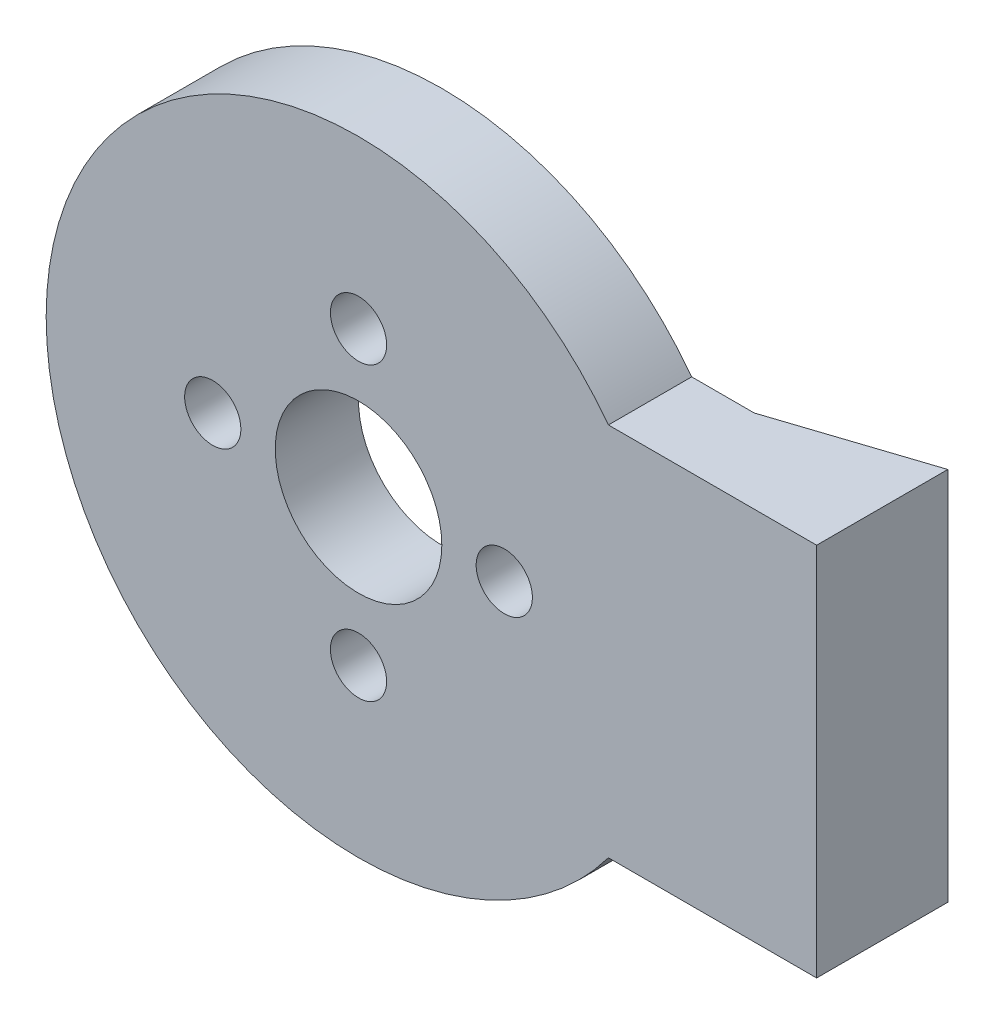
ISO-10303-21;
HEADER;
FILE_DESCRIPTION(('STEP AP214'),'2;1');
FILE_NAME('part.step','',(''),(''),'','','');
FILE_SCHEMA(('AUTOMOTIVE_DESIGN { 1 0 10303 214 1 1 1 1 }'));
ENDSEC;
DATA;
#1=APPLICATION_CONTEXT('core data for automotive mechanical design processes');
#2=APPLICATION_PROTOCOL_DEFINITION('international standard','automotive_design',2000,#1);
#3=PRODUCT_CONTEXT('',#1,'mechanical');
#4=PRODUCT('Part','Part','',(#3));
#5=PRODUCT_RELATED_PRODUCT_CATEGORY('part','',(#4));
#6=PRODUCT_DEFINITION_FORMATION('','',#4);
#7=PRODUCT_DEFINITION_CONTEXT('part definition',#1,'design');
#8=PRODUCT_DEFINITION('design','',#6,#7);
#9=PRODUCT_DEFINITION_SHAPE('','',#8);
#10=(LENGTH_UNIT() NAMED_UNIT(*) SI_UNIT(.MILLI.,.METRE.));
#11=(NAMED_UNIT(*) PLANE_ANGLE_UNIT() SI_UNIT($,.RADIAN.));
#12=(NAMED_UNIT(*) SI_UNIT($,.STERADIAN.) SOLID_ANGLE_UNIT());
#13=UNCERTAINTY_MEASURE_WITH_UNIT(LENGTH_MEASURE(1.E-05),#10,'distance_accuracy_value','');
#14=(GEOMETRIC_REPRESENTATION_CONTEXT(3) GLOBAL_UNCERTAINTY_ASSIGNED_CONTEXT((#13)) GLOBAL_UNIT_ASSIGNED_CONTEXT((#10,
#11,#12)) REPRESENTATION_CONTEXT('',''));
#15=CARTESIAN_POINT('',(0.,0.,0.));
#16=DIRECTION('',(0.,0.,1.));
#17=DIRECTION('',(1.,0.,0.));
#18=AXIS2_PLACEMENT_3D('',#15,#16,#17);
#19=CARTESIAN_POINT('',(22.,-9.,41.8));
#20=DIRECTION('',(0.,0.,1.));
#21=DIRECTION('',(1.,0.,0.));
#22=AXIS2_PLACEMENT_3D('',#19,#20,#21);
#23=PLANE('',#22);
#24=CARTESIAN_POINT('',(-7.,0.,41.8));
#25=DIRECTION('',(0.,0.,-1.));
#26=DIRECTION('',(1.,0.,0.));
#27=AXIS2_PLACEMENT_3D('',#24,#25,#26);
#28=CIRCLE('',#27,1.35);
#29=CARTESIAN_POINT('',(-5.65,0.,41.8));
#30=VERTEX_POINT('',#29);
#31=EDGE_CURVE('E128',#30,#30,#28,.T.);
#32=ORIENTED_EDGE('',*,*,#31,.T.);
#33=EDGE_LOOP('',(#32));
#34=FACE_BOUND('',#33,.T.);
#35=CARTESIAN_POINT('',(0.,-7.,41.8));
#36=DIRECTION('',(0.,0.,-1.));
#37=DIRECTION('',(1.,0.,0.));
#38=AXIS2_PLACEMENT_3D('',#35,#36,#37);
#39=CIRCLE('',#38,1.35);
#40=CARTESIAN_POINT('',(1.35,-7.,41.8));
#41=VERTEX_POINT('',#40);
#42=EDGE_CURVE('E140',#41,#41,#39,.T.);
#43=ORIENTED_EDGE('',*,*,#42,.T.);
#44=EDGE_LOOP('',(#43));
#45=FACE_BOUND('',#44,.T.);
#46=CARTESIAN_POINT('',(0.,0.,41.8));
#47=DIRECTION('',(0.,0.,-1.));
#48=DIRECTION('',(1.,0.,0.));
#49=AXIS2_PLACEMENT_3D('',#46,#47,#48);
#50=CIRCLE('',#49,4.);
#51=CARTESIAN_POINT('',(4.,0.,41.8));
#52=VERTEX_POINT('',#51);
#53=EDGE_CURVE('E41',#52,#52,#50,.T.);
#54=ORIENTED_EDGE('',*,*,#53,.T.);
#55=EDGE_LOOP('',(#54));
#56=FACE_BOUND('',#55,.T.);
#57=CARTESIAN_POINT('',(7.,0.,41.8));
#58=DIRECTION('',(0.,0.,-1.));
#59=DIRECTION('',(1.,0.,0.));
#60=AXIS2_PLACEMENT_3D('',#57,#58,#59);
#61=CIRCLE('',#60,1.35);
#62=CARTESIAN_POINT('',(8.35,0.,41.8));
#63=VERTEX_POINT('',#62);
#64=EDGE_CURVE('E11',#63,#63,#61,.T.);
#65=ORIENTED_EDGE('',*,*,#64,.T.);
#66=EDGE_LOOP('',(#65));
#67=FACE_BOUND('',#66,.T.);
#68=CARTESIAN_POINT('',(0.,7.,41.8));
#69=DIRECTION('',(0.,0.,-1.));
#70=DIRECTION('',(1.,0.,0.));
#71=AXIS2_PLACEMENT_3D('',#68,#69,#70);
#72=CIRCLE('',#71,1.35);
#73=CARTESIAN_POINT('',(1.35,7.,41.8));
#74=VERTEX_POINT('',#73);
#75=EDGE_CURVE('E116',#74,#74,#72,.T.);
#76=ORIENTED_EDGE('',*,*,#75,.T.);
#77=EDGE_LOOP('',(#76));
#78=FACE_BOUND('',#77,.T.);
#79=DIRECTION('',(-1.,0.,0.));
#80=VECTOR('',#79,1.);
#81=CARTESIAN_POINT('',(22.,-9.,41.8));
#82=LINE('',#81,#80);
#83=CARTESIAN_POINT('',(22.,-9.,41.8));
#84=VERTEX_POINT('',#83);
#85=CARTESIAN_POINT('',(12.,-9.,41.8));
#86=VERTEX_POINT('',#85);
#87=EDGE_CURVE('E191',#84,#86,#82,.T.);
#88=ORIENTED_EDGE('',*,*,#87,.F.);
#89=DIRECTION('',(0.,1.,0.));
#90=VECTOR('',#89,1.);
#91=CARTESIAN_POINT('',(22.,-9.,41.8));
#92=LINE('',#91,#90);
#93=CARTESIAN_POINT('',(22.,9.,41.8));
#94=VERTEX_POINT('',#93);
#95=EDGE_CURVE('E182',#84,#94,#92,.T.);
#96=ORIENTED_EDGE('',*,*,#95,.T.);
#97=DIRECTION('',(-1.,0.,0.));
#98=VECTOR('',#97,1.);
#99=CARTESIAN_POINT('',(22.,9.,41.8));
#100=LINE('',#99,#98);
#101=CARTESIAN_POINT('',(12.,9.,41.8));
#102=VERTEX_POINT('',#101);
#103=EDGE_CURVE('E154',#94,#102,#100,.T.);
#104=ORIENTED_EDGE('',*,*,#103,.T.);
#105=CARTESIAN_POINT('',(0.,0.,41.8));
#106=DIRECTION('',(0.,0.,1.));
#107=DIRECTION('',(1.,0.,0.));
#108=AXIS2_PLACEMENT_3D('',#105,#106,#107);
#109=CIRCLE('',#108,15.);
#110=EDGE_CURVE('E129',#102,#86,#109,.T.);
#111=ORIENTED_EDGE('',*,*,#110,.T.);
#112=EDGE_LOOP('',(#88,#96,#104,#111));
#113=FACE_BOUND('',#112,.T.);
#114=ADVANCED_FACE('F17',(#34,#45,#56,#67,#78,#113),#23,.T.);
#115=CARTESIAN_POINT('',(7.,0.,-10.));
#116=DIRECTION('',(0.,0.,-1.));
#117=DIRECTION('',(1.,0.,0.));
#118=AXIS2_PLACEMENT_3D('',#115,#116,#117);
#119=CYLINDRICAL_SURFACE('',#118,1.35);
#120=CARTESIAN_POINT('',(7.,0.,37.8));
#121=DIRECTION('',(0.,0.,-1.));
#122=DIRECTION('',(1.,0.,0.));
#123=AXIS2_PLACEMENT_3D('',#120,#121,#122);
#124=CIRCLE('',#123,1.35);
#125=CARTESIAN_POINT('',(8.35,0.,37.8));
#126=VERTEX_POINT('',#125);
#127=EDGE_CURVE('E155',#126,#126,#124,.T.);
#128=ORIENTED_EDGE('',*,*,#127,.T.);
#129=DIRECTION('',(0.,0.,1.));
#130=VECTOR('',#129,1.);
#131=CARTESIAN_POINT('',(8.35,0.,-10.));
#132=LINE('',#131,#130);
#133=EDGE_CURVE('E27',#126,#63,#132,.T.);
#134=ORIENTED_EDGE('',*,*,#133,.T.);
#135=ORIENTED_EDGE('',*,*,#64,.F.);
#136=ORIENTED_EDGE('',*,*,#133,.F.);
#137=EDGE_LOOP('',(#128,#134,#135,#136));
#138=FACE_BOUND('',#137,.T.);
#139=ADVANCED_FACE('F147',(#138),#119,.F.);
#140=CARTESIAN_POINT('',(0.,0.,-10.));
#141=DIRECTION('',(0.,0.,-1.));
#142=DIRECTION('',(1.,0.,0.));
#143=AXIS2_PLACEMENT_3D('',#140,#141,#142);
#144=CYLINDRICAL_SURFACE('',#143,4.);
#145=CARTESIAN_POINT('',(0.,0.,37.8));
#146=DIRECTION('',(0.,0.,-1.));
#147=DIRECTION('',(1.,0.,0.));
#148=AXIS2_PLACEMENT_3D('',#145,#146,#147);
#149=CIRCLE('',#148,4.);
#150=CARTESIAN_POINT('',(4.,0.,37.8));
#151=VERTEX_POINT('',#150);
#152=EDGE_CURVE('E156',#151,#151,#149,.T.);
#153=ORIENTED_EDGE('',*,*,#152,.T.);
#154=DIRECTION('',(0.,0.,1.));
#155=VECTOR('',#154,1.);
#156=CARTESIAN_POINT('',(4.,0.,-10.));
#157=LINE('',#156,#155);
#158=EDGE_CURVE('E138',#151,#52,#157,.T.);
#159=ORIENTED_EDGE('',*,*,#158,.T.);
#160=ORIENTED_EDGE('',*,*,#53,.F.);
#161=ORIENTED_EDGE('',*,*,#158,.F.);
#162=EDGE_LOOP('',(#153,#159,#160,#161));
#163=FACE_BOUND('',#162,.T.);
#164=ADVANCED_FACE('F19',(#163),#144,.F.);
#165=CARTESIAN_POINT('',(0.,-7.,-10.));
#166=DIRECTION('',(0.,0.,-1.));
#167=DIRECTION('',(1.,0.,0.));
#168=AXIS2_PLACEMENT_3D('',#165,#166,#167);
#169=CYLINDRICAL_SURFACE('',#168,1.35);
#170=CARTESIAN_POINT('',(0.,-7.,37.8));
#171=DIRECTION('',(0.,0.,-1.));
#172=DIRECTION('',(1.,0.,0.));
#173=AXIS2_PLACEMENT_3D('',#170,#171,#172);
#174=CIRCLE('',#173,1.35);
#175=CARTESIAN_POINT('',(1.35,-7.,37.8));
#176=VERTEX_POINT('',#175);
#177=EDGE_CURVE('E170',#176,#176,#174,.T.);
#178=ORIENTED_EDGE('',*,*,#177,.T.);
#179=DIRECTION('',(0.,0.,1.));
#180=VECTOR('',#179,1.);
#181=CARTESIAN_POINT('',(1.35,-7.,-10.));
#182=LINE('',#181,#180);
#183=EDGE_CURVE('E137',#176,#41,#182,.T.);
#184=ORIENTED_EDGE('',*,*,#183,.T.);
#185=ORIENTED_EDGE('',*,*,#42,.F.);
#186=ORIENTED_EDGE('',*,*,#183,.F.);
#187=EDGE_LOOP('',(#178,#184,#185,#186));
#188=FACE_BOUND('',#187,.T.);
#189=ADVANCED_FACE('F264',(#188),#169,.F.);
#190=CARTESIAN_POINT('',(-7.,0.,-10.));
#191=DIRECTION('',(0.,0.,-1.));
#192=DIRECTION('',(1.,0.,0.));
#193=AXIS2_PLACEMENT_3D('',#190,#191,#192);
#194=CYLINDRICAL_SURFACE('',#193,1.35);
#195=CARTESIAN_POINT('',(-7.,0.,37.8));
#196=DIRECTION('',(0.,0.,-1.));
#197=DIRECTION('',(1.,0.,0.));
#198=AXIS2_PLACEMENT_3D('',#195,#196,#197);
#199=CIRCLE('',#198,1.35);
#200=CARTESIAN_POINT('',(-5.65,0.,37.8));
#201=VERTEX_POINT('',#200);
#202=EDGE_CURVE('E171',#201,#201,#199,.T.);
#203=ORIENTED_EDGE('',*,*,#202,.T.);
#204=DIRECTION('',(0.,0.,1.));
#205=VECTOR('',#204,1.);
#206=CARTESIAN_POINT('',(-5.65,0.,-10.));
#207=LINE('',#206,#205);
#208=EDGE_CURVE('E122',#201,#30,#207,.T.);
#209=ORIENTED_EDGE('',*,*,#208,.T.);
#210=ORIENTED_EDGE('',*,*,#31,.F.);
#211=ORIENTED_EDGE('',*,*,#208,.F.);
#212=EDGE_LOOP('',(#203,#209,#210,#211));
#213=FACE_BOUND('',#212,.T.);
#214=ADVANCED_FACE('F250',(#213),#194,.F.);
#215=CARTESIAN_POINT('',(0.,7.,-10.));
#216=DIRECTION('',(0.,0.,-1.));
#217=DIRECTION('',(1.,0.,0.));
#218=AXIS2_PLACEMENT_3D('',#215,#216,#217);
#219=CYLINDRICAL_SURFACE('',#218,1.35);
#220=CARTESIAN_POINT('',(0.,7.,37.8));
#221=DIRECTION('',(0.,0.,-1.));
#222=DIRECTION('',(1.,0.,0.));
#223=AXIS2_PLACEMENT_3D('',#220,#221,#222);
#224=CIRCLE('',#223,1.35);
#225=CARTESIAN_POINT('',(1.35,7.,37.8));
#226=VERTEX_POINT('',#225);
#227=EDGE_CURVE('E174',#226,#226,#224,.T.);
#228=ORIENTED_EDGE('',*,*,#227,.T.);
#229=DIRECTION('',(0.,0.,1.));
#230=VECTOR('',#229,1.);
#231=CARTESIAN_POINT('',(1.35,7.,-10.));
#232=LINE('',#231,#230);
#233=EDGE_CURVE('E125',#226,#74,#232,.T.);
#234=ORIENTED_EDGE('',*,*,#233,.T.);
#235=ORIENTED_EDGE('',*,*,#75,.F.);
#236=ORIENTED_EDGE('',*,*,#233,.F.);
#237=EDGE_LOOP('',(#228,#234,#235,#236));
#238=FACE_BOUND('',#237,.T.);
#239=ADVANCED_FACE('F258',(#238),#219,.F.);
#240=CARTESIAN_POINT('',(0.,0.,37.8));
#241=DIRECTION('',(0.,0.,-1.));
#242=DIRECTION('',(1.,0.,0.));
#243=AXIS2_PLACEMENT_3D('',#240,#241,#242);
#244=CYLINDRICAL_SURFACE('',#243,15.);
#245=DIRECTION('',(0.,0.,-1.));
#246=VECTOR('',#245,1.);
#247=CARTESIAN_POINT('',(12.,-9.,37.8));
#248=LINE('',#247,#246);
#249=CARTESIAN_POINT('',(12.,-9.,37.8));
#250=VERTEX_POINT('',#249);
#251=EDGE_CURVE('E192',#86,#250,#248,.T.);
#252=ORIENTED_EDGE('',*,*,#251,.F.);
#253=ORIENTED_EDGE('',*,*,#110,.F.);
#254=DIRECTION('',(0.,0.,-1.));
#255=VECTOR('',#254,1.);
#256=CARTESIAN_POINT('',(12.,9.,37.8));
#257=LINE('',#256,#255);
#258=CARTESIAN_POINT('',(12.,9.,37.8));
#259=VERTEX_POINT('',#258);
#260=EDGE_CURVE('E181',#102,#259,#257,.T.);
#261=ORIENTED_EDGE('',*,*,#260,.T.);
#262=CARTESIAN_POINT('',(0.,0.,37.8));
#263=DIRECTION('',(0.,0.,1.));
#264=DIRECTION('',(1.,0.,0.));
#265=AXIS2_PLACEMENT_3D('',#262,#263,#264);
#266=CIRCLE('',#265,15.);
#267=EDGE_CURVE('E209',#259,#250,#266,.T.);
#268=ORIENTED_EDGE('',*,*,#267,.T.);
#269=EDGE_LOOP('',(#252,#253,#261,#268));
#270=FACE_BOUND('',#269,.T.);
#271=ADVANCED_FACE('F208',(#270),#244,.T.);
#272=CARTESIAN_POINT('',(16.424609518711,-9.,39.32536437998));
#273=DIRECTION('',(0.,-1.,0.));
#274=DIRECTION('',(0.,0.,-1.));
#275=AXIS2_PLACEMENT_3D('',#272,#273,#274);
#276=PLANE('',#275);
#277=ORIENTED_EDGE('',*,*,#251,.T.);
#278=DIRECTION('',(1.,0.,0.));
#279=VECTOR('',#278,1.);
#280=CARTESIAN_POINT('',(10.,-9.,37.8));
#281=LINE('',#280,#279);
#282=CARTESIAN_POINT('',(15.,-9.,37.8));
#283=VERTEX_POINT('',#282);
#284=EDGE_CURVE('E214',#250,#283,#281,.T.);
#285=ORIENTED_EDGE('',*,*,#284,.T.);
#286=DIRECTION('',(0.950031749040575,0.,-0.312153288970189));
#287=VECTOR('',#286,1.);
#288=CARTESIAN_POINT('',(15.,-9.,37.8));
#289=LINE('',#288,#287);
#290=CARTESIAN_POINT('',(22.,-9.,35.5));
#291=VERTEX_POINT('',#290);
#292=EDGE_CURVE('E224',#283,#291,#289,.T.);
#293=ORIENTED_EDGE('',*,*,#292,.T.);
#294=DIRECTION('',(0.,0.,1.));
#295=VECTOR('',#294,1.);
#296=CARTESIAN_POINT('',(22.,-9.,35.5));
#297=LINE('',#296,#295);
#298=EDGE_CURVE('E190',#291,#84,#297,.T.);
#299=ORIENTED_EDGE('',*,*,#298,.T.);
#300=ORIENTED_EDGE('',*,*,#87,.T.);
#301=EDGE_LOOP('',(#277,#285,#293,#299,#300));
#302=FACE_BOUND('',#301,.T.);
#303=ADVANCED_FACE('F204',(#302),#276,.T.);
#304=CARTESIAN_POINT('',(22.,-9.,35.5));
#305=DIRECTION('',(1.,0.,0.));
#306=DIRECTION('',(0.,1.,0.));
#307=AXIS2_PLACEMENT_3D('',#304,#305,#306);
#308=PLANE('',#307);
#309=DIRECTION('',(0.,1.,0.));
#310=VECTOR('',#309,1.);
#311=CARTESIAN_POINT('',(22.,-9.,35.5));
#312=LINE('',#311,#310);
#313=CARTESIAN_POINT('',(22.,9.,35.5));
#314=VERTEX_POINT('',#313);
#315=EDGE_CURVE('E228',#291,#314,#312,.T.);
#316=ORIENTED_EDGE('',*,*,#315,.T.);
#317=DIRECTION('',(0.,0.,1.));
#318=VECTOR('',#317,1.);
#319=CARTESIAN_POINT('',(22.,9.,35.5));
#320=LINE('',#319,#318);
#321=EDGE_CURVE('E162',#314,#94,#320,.T.);
#322=ORIENTED_EDGE('',*,*,#321,.T.);
#323=ORIENTED_EDGE('',*,*,#95,.F.);
#324=ORIENTED_EDGE('',*,*,#298,.F.);
#325=EDGE_LOOP('',(#316,#322,#323,#324));
#326=FACE_BOUND('',#325,.T.);
#327=ADVANCED_FACE('F279',(#326),#308,.T.);
#328=CARTESIAN_POINT('',(16.424609518711,9.,39.32536437998));
#329=DIRECTION('',(0.,-1.,0.));
#330=DIRECTION('',(0.,0.,-1.));
#331=AXIS2_PLACEMENT_3D('',#328,#329,#330);
#332=PLANE('',#331);
#333=ORIENTED_EDGE('',*,*,#103,.F.);
#334=ORIENTED_EDGE('',*,*,#321,.F.);
#335=DIRECTION('',(0.950031749040575,0.,-0.312153288970189));
#336=VECTOR('',#335,1.);
#337=CARTESIAN_POINT('',(15.,9.,37.8));
#338=LINE('',#337,#336);
#339=CARTESIAN_POINT('',(15.,9.,37.8));
#340=VERTEX_POINT('',#339);
#341=EDGE_CURVE('E234',#340,#314,#338,.T.);
#342=ORIENTED_EDGE('',*,*,#341,.F.);
#343=DIRECTION('',(1.,0.,0.));
#344=VECTOR('',#343,1.);
#345=CARTESIAN_POINT('',(10.,9.,37.8));
#346=LINE('',#345,#344);
#347=EDGE_CURVE('E177',#259,#340,#346,.T.);
#348=ORIENTED_EDGE('',*,*,#347,.F.);
#349=ORIENTED_EDGE('',*,*,#260,.F.);
#350=EDGE_LOOP('',(#333,#334,#342,#348,#349));
#351=FACE_BOUND('',#350,.T.);
#352=ADVANCED_FACE('F251',(#351),#332,.F.);
#353=CARTESIAN_POINT('',(10.,-9.,37.8));
#354=DIRECTION('',(0.,0.,-1.));
#355=DIRECTION('',(0.,-1.,0.));
#356=AXIS2_PLACEMENT_3D('',#353,#354,#355);
#357=PLANE('',#356);
#358=ORIENTED_EDGE('',*,*,#127,.F.);
#359=EDGE_LOOP('',(#358));
#360=FACE_BOUND('',#359,.T.);
#361=ORIENTED_EDGE('',*,*,#152,.F.);
#362=EDGE_LOOP('',(#361));
#363=FACE_BOUND('',#362,.T.);
#364=ORIENTED_EDGE('',*,*,#177,.F.);
#365=EDGE_LOOP('',(#364));
#366=FACE_BOUND('',#365,.T.);
#367=ORIENTED_EDGE('',*,*,#202,.F.);
#368=EDGE_LOOP('',(#367));
#369=FACE_BOUND('',#368,.T.);
#370=ORIENTED_EDGE('',*,*,#227,.F.);
#371=EDGE_LOOP('',(#370));
#372=FACE_BOUND('',#371,.T.);
#373=ORIENTED_EDGE('',*,*,#284,.F.);
#374=ORIENTED_EDGE('',*,*,#267,.F.);
#375=ORIENTED_EDGE('',*,*,#347,.T.);
#376=DIRECTION('',(0.,1.,0.));
#377=VECTOR('',#376,1.);
#378=CARTESIAN_POINT('',(15.,-9.,37.8));
#379=LINE('',#378,#377);
#380=EDGE_CURVE('E219',#283,#340,#379,.T.);
#381=ORIENTED_EDGE('',*,*,#380,.F.);
#382=EDGE_LOOP('',(#373,#374,#375,#381));
#383=FACE_BOUND('',#382,.T.);
#384=ADVANCED_FACE('F217',(#360,#363,#366,#369,#372,#383),#357,.T.);
#385=CARTESIAN_POINT('',(15.,-9.,37.8));
#386=DIRECTION('',(-0.312153288970189,0.,-0.950031749040575));
#387=DIRECTION('',(-0.950031749040575,0.,0.312153288970189));
#388=AXIS2_PLACEMENT_3D('',#385,#386,#387);
#389=PLANE('',#388);
#390=ORIENTED_EDGE('',*,*,#380,.T.);
#391=ORIENTED_EDGE('',*,*,#341,.T.);
#392=ORIENTED_EDGE('',*,*,#315,.F.);
#393=ORIENTED_EDGE('',*,*,#292,.F.);
#394=EDGE_LOOP('',(#390,#391,#392,#393));
#395=FACE_BOUND('',#394,.T.);
#396=ADVANCED_FACE('F252',(#395),#389,.T.);
#397=CLOSED_SHELL('',(#114,#139,#164,#189,#214,#239,#271,#303,#327,#352,#384,#396));
#398=MANIFOLD_SOLID_BREP('B1',#397);
#399=ADVANCED_BREP_SHAPE_REPRESENTATION('',(#18,#398),#14);
#400=SHAPE_DEFINITION_REPRESENTATION(#9,#399);
ENDSEC;
END-ISO-10303-21;
